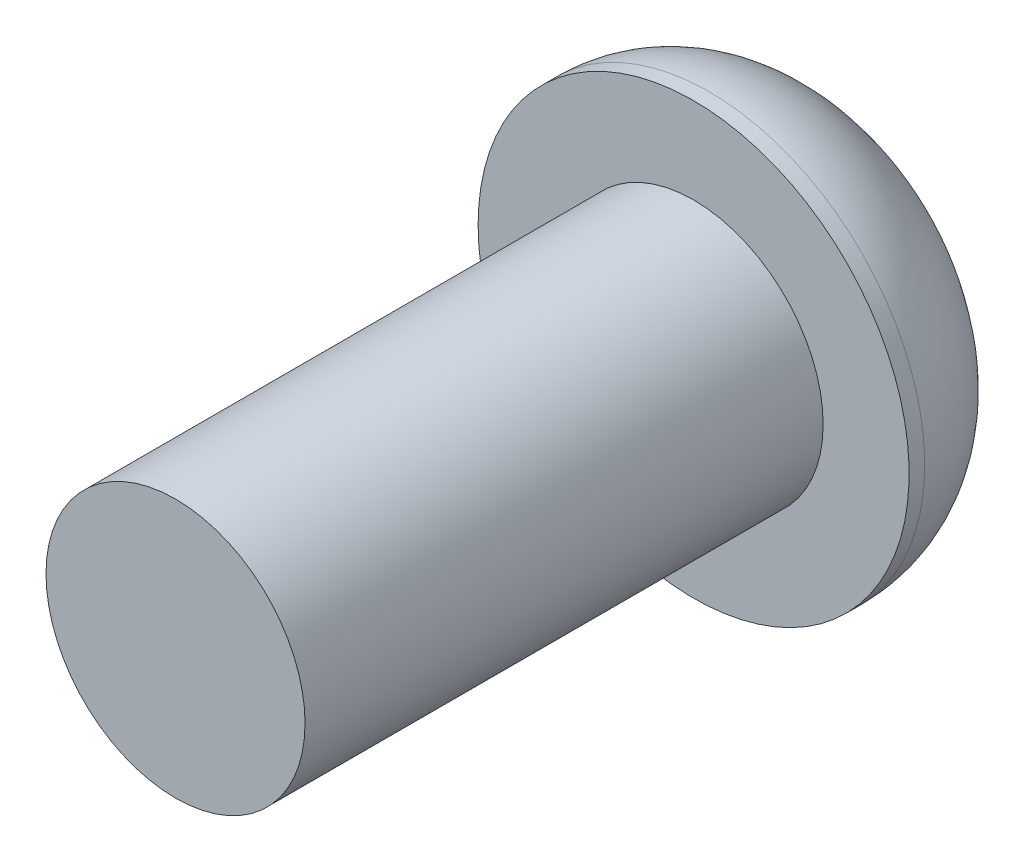
ISO-10303-21;
HEADER;
FILE_DESCRIPTION(('STEP AP214'),'2;1');
FILE_NAME('part.step','',(''),(''),'','','');
FILE_SCHEMA(('AUTOMOTIVE_DESIGN { 1 0 10303 214 1 1 1 1 }'));
ENDSEC;
DATA;
#1=APPLICATION_CONTEXT('core data for automotive mechanical design processes');
#2=APPLICATION_PROTOCOL_DEFINITION('international standard','automotive_design',2000,#1);
#3=PRODUCT_CONTEXT('',#1,'mechanical');
#4=PRODUCT('Part','Part','',(#3));
#5=PRODUCT_RELATED_PRODUCT_CATEGORY('part','',(#4));
#6=PRODUCT_DEFINITION_FORMATION('','',#4);
#7=PRODUCT_DEFINITION_CONTEXT('part definition',#1,'design');
#8=PRODUCT_DEFINITION('design','',#6,#7);
#9=PRODUCT_DEFINITION_SHAPE('','',#8);
#10=(LENGTH_UNIT() NAMED_UNIT(*) SI_UNIT(.MILLI.,.METRE.));
#11=(NAMED_UNIT(*) PLANE_ANGLE_UNIT() SI_UNIT($,.RADIAN.));
#12=(NAMED_UNIT(*) SI_UNIT($,.STERADIAN.) SOLID_ANGLE_UNIT());
#13=UNCERTAINTY_MEASURE_WITH_UNIT(LENGTH_MEASURE(1.E-05),#10,'distance_accuracy_value','');
#14=(GEOMETRIC_REPRESENTATION_CONTEXT(3) GLOBAL_UNCERTAINTY_ASSIGNED_CONTEXT((#13)) GLOBAL_UNIT_ASSIGNED_CONTEXT((#10,
#11,#12)) REPRESENTATION_CONTEXT('',''));
#15=CARTESIAN_POINT('',(0.,0.,0.));
#16=DIRECTION('',(0.,0.,1.));
#17=DIRECTION('',(1.,0.,0.));
#18=AXIS2_PLACEMENT_3D('',#15,#16,#17);
#19=CARTESIAN_POINT('',(0.,0.,10.));
#20=DIRECTION('',(0.,0.,-1.));
#21=DIRECTION('',(-1.,0.,0.));
#22=AXIS2_PLACEMENT_3D('',#19,#20,#21);
#23=CYLINDRICAL_SURFACE('',#22,2.5);
#24=CARTESIAN_POINT('',(0.,0.,10.));
#25=DIRECTION('',(0.,0.,1.));
#26=DIRECTION('',(1.,0.,0.));
#27=AXIS2_PLACEMENT_3D('',#24,#25,#26);
#28=CIRCLE('',#27,2.5);
#29=CARTESIAN_POINT('',(2.5,0.,10.));
#30=VERTEX_POINT('',#29);
#31=EDGE_CURVE('E146',#30,#30,#28,.T.);
#32=ORIENTED_EDGE('',*,*,#31,.F.);
#33=EDGE_LOOP('',(#32));
#34=FACE_BOUND('',#33,.T.);
#35=CARTESIAN_POINT('',(0.,0.,0.));
#36=DIRECTION('',(0.,0.,-1.));
#37=DIRECTION('',(-1.,0.,0.));
#38=AXIS2_PLACEMENT_3D('',#35,#36,#37);
#39=CIRCLE('',#38,2.5);
#40=CARTESIAN_POINT('',(-2.5,0.,0.));
#41=VERTEX_POINT('',#40);
#42=EDGE_CURVE('E143',#41,#41,#39,.T.);
#43=ORIENTED_EDGE('',*,*,#42,.F.);
#44=EDGE_LOOP('',(#43));
#45=FACE_BOUND('',#44,.T.);
#46=ADVANCED_FACE('F33',(#34,#45),#23,.T.);
#47=CARTESIAN_POINT('',(0.,0.,10.));
#48=DIRECTION('',(0.,0.,1.));
#49=DIRECTION('',(1.,0.,0.));
#50=AXIS2_PLACEMENT_3D('',#47,#48,#49);
#51=PLANE('',#50);
#52=ORIENTED_EDGE('',*,*,#31,.T.);
#53=EDGE_LOOP('',(#52));
#54=FACE_BOUND('',#53,.T.);
#55=ADVANCED_FACE('F167',(#54),#51,.T.);
#56=CARTESIAN_POINT('',(0.,0.,0.));
#57=DIRECTION('',(0.,0.,-1.));
#58=DIRECTION('',(-1.,0.,0.));
#59=AXIS2_PLACEMENT_3D('',#56,#57,#58);
#60=PLANE('',#59);
#61=CARTESIAN_POINT('',(0.,0.,0.));
#62=DIRECTION('',(0.,0.,-1.));
#63=DIRECTION('',(-1.,0.,0.));
#64=AXIS2_PLACEMENT_3D('',#61,#62,#63);
#65=CIRCLE('',#64,4.15958487677486);
#66=CARTESIAN_POINT('',(-4.15958487677486,0.,0.));
#67=VERTEX_POINT('',#66);
#68=EDGE_CURVE('E135',#67,#67,#65,.T.);
#69=ORIENTED_EDGE('',*,*,#68,.F.);
#70=EDGE_LOOP('',(#69));
#71=FACE_BOUND('',#70,.T.);
#72=ORIENTED_EDGE('',*,*,#42,.T.);
#73=EDGE_LOOP('',(#72));
#74=FACE_BOUND('',#73,.T.);
#75=ADVANCED_FACE('F172',(#71,#74),#60,.F.);
#76=CARTESIAN_POINT('',(0.,0.,-2.8));
#77=DIRECTION('',(0.,0.,1.));
#78=DIRECTION('',(1.,0.,0.));
#79=AXIS2_PLACEMENT_3D('',#76,#77,#78);
#80=CYLINDRICAL_SURFACE('',#79,4.15958487677486);
#81=CARTESIAN_POINT('',(0.,0.,-0.3));
#82=DIRECTION('',(0.,0.,-1.));
#83=DIRECTION('',(-1.,0.,0.));
#84=AXIS2_PLACEMENT_3D('',#81,#82,#83);
#85=CIRCLE('',#84,4.15958487677486);
#86=CARTESIAN_POINT('',(-4.15958487677486,0.,-0.3));
#87=VERTEX_POINT('',#86);
#88=EDGE_CURVE('E11',#87,#87,#85,.F.);
#89=ORIENTED_EDGE('',*,*,#88,.T.);
#90=EDGE_LOOP('',(#89));
#91=FACE_BOUND('',#90,.T.);
#92=ORIENTED_EDGE('',*,*,#68,.T.);
#93=EDGE_LOOP('',(#92));
#94=FACE_BOUND('',#93,.T.);
#95=ADVANCED_FACE('F162',(#91,#94),#80,.T.);
#96=CARTESIAN_POINT('',(0.,0.,-2.8));
#97=DIRECTION('',(0.,0.,-1.));
#98=DIRECTION('',(-1.,0.,0.));
#99=AXIS2_PLACEMENT_3D('',#96,#97,#98);
#100=PLANE('',#99);
#101=DIRECTION('',(-0.814788791019046,0.579757902947188,0.));
#102=VECTOR('',#101,1.);
#103=CARTESIAN_POINT('',(-0.144973678126217,-1.52414450415627,-2.8));
#104=LINE('',#103,#102);
#105=CARTESIAN_POINT('',(-0.144973678126217,-1.52414450415627,-2.8));
#106=VERTEX_POINT('',#105);
#107=CARTESIAN_POINT('',(-1.39243469870088,-0.636521363940765,-2.8));
#108=VERTEX_POINT('',#107);
#109=EDGE_CURVE('E48',#106,#108,#104,.T.);
#110=ORIENTED_EDGE('',*,*,#109,.F.);
#111=DIRECTION('',(-0.909479467506581,-0.415748840267711,0.));
#112=VECTOR('',#111,1.);
#113=CARTESIAN_POINT('',(1.24746102057466,-0.887623140215509,-2.8));
#114=LINE('',#113,#112);
#115=CARTESIAN_POINT('',(1.24746102057466,-0.887623140215509,-2.8));
#116=VERTEX_POINT('',#115);
#117=EDGE_CURVE('E131',#116,#106,#114,.T.);
#118=ORIENTED_EDGE('',*,*,#117,.F.);
#119=DIRECTION('',(-0.0946906764875342,-0.995506743214898,0.));
#120=VECTOR('',#119,1.);
#121=CARTESIAN_POINT('',(1.39243469870088,0.636521363940765,-2.8));
#122=LINE('',#121,#120);
#123=CARTESIAN_POINT('',(1.39243469870088,0.636521363940765,-2.8));
#124=VERTEX_POINT('',#123);
#125=EDGE_CURVE('E129',#124,#116,#122,.T.);
#126=ORIENTED_EDGE('',*,*,#125,.F.);
#127=DIRECTION('',(0.814788791019046,-0.579757902947188,0.));
#128=VECTOR('',#127,1.);
#129=CARTESIAN_POINT('',(0.144973678126217,1.52414450415627,-2.8));
#130=LINE('',#129,#128);
#131=CARTESIAN_POINT('',(0.144973678126217,1.52414450415627,-2.8));
#132=VERTEX_POINT('',#131);
#133=EDGE_CURVE('E96',#132,#124,#130,.T.);
#134=ORIENTED_EDGE('',*,*,#133,.F.);
#135=DIRECTION('',(0.909479467506581,0.41574884026771,0.));
#136=VECTOR('',#135,1.);
#137=CARTESIAN_POINT('',(-1.24746102057466,0.88762314021551,-2.8));
#138=LINE('',#137,#136);
#139=CARTESIAN_POINT('',(-1.24746102057466,0.88762314021551,-2.8));
#140=VERTEX_POINT('',#139);
#141=EDGE_CURVE('E125',#140,#132,#138,.T.);
#142=ORIENTED_EDGE('',*,*,#141,.F.);
#143=DIRECTION('',(0.0946906764875343,0.995506743214898,0.));
#144=VECTOR('',#143,1.);
#145=CARTESIAN_POINT('',(-1.39243469870088,-0.636521363940765,-2.8));
#146=LINE('',#145,#144);
#147=EDGE_CURVE('E122',#108,#140,#146,.T.);
#148=ORIENTED_EDGE('',*,*,#147,.F.);
#149=EDGE_LOOP('',(#110,#118,#126,#134,#142,#148));
#150=FACE_BOUND('',#149,.T.);
#151=CARTESIAN_POINT('',(0.,0.,-2.8));
#152=DIRECTION('',(0.,0.,-1.));
#153=DIRECTION('',(-1.,0.,0.));
#154=AXIS2_PLACEMENT_3D('',#151,#152,#153);
#155=CIRCLE('',#154,1.65958487677486);
#156=CARTESIAN_POINT('',(-1.65958487677486,0.,-2.8));
#157=VERTEX_POINT('',#156);
#158=EDGE_CURVE('E41',#157,#157,#155,.T.);
#159=ORIENTED_EDGE('',*,*,#158,.T.);
#160=EDGE_LOOP('',(#159));
#161=FACE_BOUND('',#160,.T.);
#162=ADVANCED_FACE('F151',(#150,#161),#100,.T.);
#163=CARTESIAN_POINT('',(0.,0.,-0.3));
#164=DIRECTION('',(0.,0.,-1.));
#165=DIRECTION('',(-1.,0.,0.));
#166=AXIS2_PLACEMENT_3D('',#163,#164,#165);
#167=DEGENERATE_TOROIDAL_SURFACE('',#166,1.65958487677486,2.5,.T.);
#168=ORIENTED_EDGE('',*,*,#88,.F.);
#169=EDGE_LOOP('',(#168));
#170=FACE_BOUND('',#169,.T.);
#171=ORIENTED_EDGE('',*,*,#158,.F.);
#172=EDGE_LOOP('',(#171));
#173=FACE_BOUND('',#172,.T.);
#174=ADVANCED_FACE('F35',(#170,#173),#167,.T.);
#175=CARTESIAN_POINT('',(-0.144973678126217,-1.52414450415627,-0.8));
#176=DIRECTION('',(-0.579757902947188,-0.814788791019046,0.));
#177=DIRECTION('',(0.814788791019046,-0.579757902947188,0.));
#178=AXIS2_PLACEMENT_3D('',#175,#176,#177);
#179=PLANE('',#178);
#180=ORIENTED_EDGE('',*,*,#109,.T.);
#181=DIRECTION('',(0.,0.,-1.));
#182=VECTOR('',#181,1.);
#183=CARTESIAN_POINT('',(-1.39243469870088,-0.636521363940765,-0.8));
#184=LINE('',#183,#182);
#185=CARTESIAN_POINT('',(-1.39243469870088,-0.636521363940765,-0.8));
#186=VERTEX_POINT('',#185);
#187=EDGE_CURVE('E78',#186,#108,#184,.T.);
#188=ORIENTED_EDGE('',*,*,#187,.F.);
#189=DIRECTION('',(-0.814788791019046,0.579757902947188,0.));
#190=VECTOR('',#189,1.);
#191=CARTESIAN_POINT('',(-0.144973678126217,-1.52414450415627,-0.8));
#192=LINE('',#191,#190);
#193=CARTESIAN_POINT('',(-0.144973678126217,-1.52414450415627,-0.8));
#194=VERTEX_POINT('',#193);
#195=EDGE_CURVE('E133',#194,#186,#192,.T.);
#196=ORIENTED_EDGE('',*,*,#195,.F.);
#197=DIRECTION('',(0.,0.,-1.));
#198=VECTOR('',#197,1.);
#199=CARTESIAN_POINT('',(-0.144973678126217,-1.52414450415627,-0.8));
#200=LINE('',#199,#198);
#201=EDGE_CURVE('E56',#194,#106,#200,.T.);
#202=ORIENTED_EDGE('',*,*,#201,.T.);
#203=EDGE_LOOP('',(#180,#188,#196,#202));
#204=FACE_BOUND('',#203,.T.);
#205=ADVANCED_FACE('F154',(#204),#179,.F.);
#206=CARTESIAN_POINT('',(1.24746102057466,-0.887623140215509,-0.8));
#207=DIRECTION('',(0.415748840267711,-0.909479467506581,0.));
#208=DIRECTION('',(0.909479467506581,0.415748840267711,0.));
#209=AXIS2_PLACEMENT_3D('',#206,#207,#208);
#210=PLANE('',#209);
#211=ORIENTED_EDGE('',*,*,#117,.T.);
#212=ORIENTED_EDGE('',*,*,#201,.F.);
#213=DIRECTION('',(-0.909479467506581,-0.415748840267711,0.));
#214=VECTOR('',#213,1.);
#215=CARTESIAN_POINT('',(1.24746102057466,-0.887623140215509,-0.8));
#216=LINE('',#215,#214);
#217=CARTESIAN_POINT('',(1.24746102057466,-0.887623140215509,-0.8));
#218=VERTEX_POINT('',#217);
#219=EDGE_CURVE('E108',#218,#194,#216,.T.);
#220=ORIENTED_EDGE('',*,*,#219,.F.);
#221=DIRECTION('',(0.,0.,-1.));
#222=VECTOR('',#221,1.);
#223=CARTESIAN_POINT('',(1.24746102057466,-0.887623140215509,-0.8));
#224=LINE('',#223,#222);
#225=EDGE_CURVE('E100',#218,#116,#224,.T.);
#226=ORIENTED_EDGE('',*,*,#225,.T.);
#227=EDGE_LOOP('',(#211,#212,#220,#226));
#228=FACE_BOUND('',#227,.T.);
#229=ADVANCED_FACE('F160',(#228),#210,.F.);
#230=CARTESIAN_POINT('',(1.39243469870088,0.636521363940765,-0.8));
#231=DIRECTION('',(0.995506743214898,-0.0946906764875343,0.));
#232=DIRECTION('',(0.0946906764875343,0.995506743214898,0.));
#233=AXIS2_PLACEMENT_3D('',#230,#231,#232);
#234=PLANE('',#233);
#235=ORIENTED_EDGE('',*,*,#125,.T.);
#236=ORIENTED_EDGE('',*,*,#225,.F.);
#237=DIRECTION('',(-0.0946906764875342,-0.995506743214898,0.));
#238=VECTOR('',#237,1.);
#239=CARTESIAN_POINT('',(1.39243469870088,0.636521363940765,-0.8));
#240=LINE('',#239,#238);
#241=CARTESIAN_POINT('',(1.39243469870088,0.636521363940765,-0.8));
#242=VERTEX_POINT('',#241);
#243=EDGE_CURVE('E104',#242,#218,#240,.T.);
#244=ORIENTED_EDGE('',*,*,#243,.F.);
#245=DIRECTION('',(0.,0.,-1.));
#246=VECTOR('',#245,1.);
#247=CARTESIAN_POINT('',(1.39243469870088,0.636521363940765,-0.8));
#248=LINE('',#247,#246);
#249=EDGE_CURVE('E89',#242,#124,#248,.T.);
#250=ORIENTED_EDGE('',*,*,#249,.T.);
#251=EDGE_LOOP('',(#235,#236,#244,#250));
#252=FACE_BOUND('',#251,.T.);
#253=ADVANCED_FACE('F105',(#252),#234,.F.);
#254=CARTESIAN_POINT('',(0.144973678126217,1.52414450415627,-0.8));
#255=DIRECTION('',(0.579757902947188,0.814788791019046,0.));
#256=DIRECTION('',(-0.814788791019047,0.579757902947188,0.));
#257=AXIS2_PLACEMENT_3D('',#254,#255,#256);
#258=PLANE('',#257);
#259=ORIENTED_EDGE('',*,*,#133,.T.);
#260=ORIENTED_EDGE('',*,*,#249,.F.);
#261=DIRECTION('',(0.814788791019046,-0.579757902947188,0.));
#262=VECTOR('',#261,1.);
#263=CARTESIAN_POINT('',(0.144973678126217,1.52414450415627,-0.8));
#264=LINE('',#263,#262);
#265=CARTESIAN_POINT('',(0.144973678126217,1.52414450415627,-0.8));
#266=VERTEX_POINT('',#265);
#267=EDGE_CURVE('E93',#266,#242,#264,.T.);
#268=ORIENTED_EDGE('',*,*,#267,.F.);
#269=DIRECTION('',(0.,0.,-1.));
#270=VECTOR('',#269,1.);
#271=CARTESIAN_POINT('',(0.144973678126217,1.52414450415627,-0.8));
#272=LINE('',#271,#270);
#273=EDGE_CURVE('E101',#266,#132,#272,.T.);
#274=ORIENTED_EDGE('',*,*,#273,.T.);
#275=EDGE_LOOP('',(#259,#260,#268,#274));
#276=FACE_BOUND('',#275,.T.);
#277=ADVANCED_FACE('F91',(#276),#258,.F.);
#278=CARTESIAN_POINT('',(-1.24746102057466,0.88762314021551,-0.8));
#279=DIRECTION('',(-0.41574884026771,0.909479467506581,0.));
#280=DIRECTION('',(-0.909479467506581,-0.41574884026771,0.));
#281=AXIS2_PLACEMENT_3D('',#278,#279,#280);
#282=PLANE('',#281);
#283=ORIENTED_EDGE('',*,*,#141,.T.);
#284=ORIENTED_EDGE('',*,*,#273,.F.);
#285=DIRECTION('',(0.909479467506581,0.41574884026771,0.));
#286=VECTOR('',#285,1.);
#287=CARTESIAN_POINT('',(-1.24746102057466,0.88762314021551,-0.8));
#288=LINE('',#287,#286);
#289=CARTESIAN_POINT('',(-1.24746102057466,0.88762314021551,-0.8));
#290=VERTEX_POINT('',#289);
#291=EDGE_CURVE('E114',#290,#266,#288,.T.);
#292=ORIENTED_EDGE('',*,*,#291,.F.);
#293=DIRECTION('',(0.,0.,-1.));
#294=VECTOR('',#293,1.);
#295=CARTESIAN_POINT('',(-1.24746102057466,0.88762314021551,-0.8));
#296=LINE('',#295,#294);
#297=EDGE_CURVE('E138',#290,#140,#296,.T.);
#298=ORIENTED_EDGE('',*,*,#297,.T.);
#299=EDGE_LOOP('',(#283,#284,#292,#298));
#300=FACE_BOUND('',#299,.T.);
#301=ADVANCED_FACE('F187',(#300),#282,.F.);
#302=CARTESIAN_POINT('',(-1.39243469870088,-0.636521363940765,-0.8));
#303=DIRECTION('',(-0.995506743214898,0.0946906764875343,0.));
#304=DIRECTION('',(-0.0946906764875343,-0.995506743214898,0.));
#305=AXIS2_PLACEMENT_3D('',#302,#303,#304);
#306=PLANE('',#305);
#307=ORIENTED_EDGE('',*,*,#147,.T.);
#308=ORIENTED_EDGE('',*,*,#297,.F.);
#309=DIRECTION('',(0.0946906764875343,0.995506743214898,0.));
#310=VECTOR('',#309,1.);
#311=CARTESIAN_POINT('',(-1.39243469870088,-0.636521363940765,-0.8));
#312=LINE('',#311,#310);
#313=EDGE_CURVE('E116',#186,#290,#312,.T.);
#314=ORIENTED_EDGE('',*,*,#313,.F.);
#315=ORIENTED_EDGE('',*,*,#187,.T.);
#316=EDGE_LOOP('',(#307,#308,#314,#315));
#317=FACE_BOUND('',#316,.T.);
#318=ADVANCED_FACE('F184',(#317),#306,.F.);
#319=CARTESIAN_POINT('',(0.,0.,-0.8));
#320=DIRECTION('',(0.,0.,-1.));
#321=DIRECTION('',(-1.,0.,0.));
#322=AXIS2_PLACEMENT_3D('',#319,#320,#321);
#323=PLANE('',#322);
#324=ORIENTED_EDGE('',*,*,#195,.T.);
#325=ORIENTED_EDGE('',*,*,#313,.T.);
#326=ORIENTED_EDGE('',*,*,#291,.T.);
#327=ORIENTED_EDGE('',*,*,#267,.T.);
#328=ORIENTED_EDGE('',*,*,#243,.T.);
#329=ORIENTED_EDGE('',*,*,#219,.T.);
#330=EDGE_LOOP('',(#324,#325,#326,#327,#328,#329));
#331=FACE_BOUND('',#330,.T.);
#332=ADVANCED_FACE('F111',(#331),#323,.T.);
#333=CLOSED_SHELL('',(#46,#55,#75,#95,#162,#174,#205,#229,#253,#277,#301,#318,#332));
#334=MANIFOLD_SOLID_BREP('B2',#333);
#335=ADVANCED_BREP_SHAPE_REPRESENTATION('',(#18,#334),#14);
#336=SHAPE_DEFINITION_REPRESENTATION(#9,#335);
ENDSEC;
END-ISO-10303-21;
